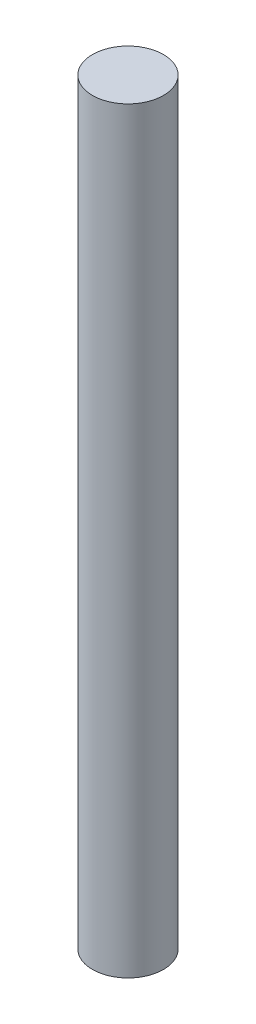
ISO-10303-21;
HEADER;
FILE_DESCRIPTION(('STEP AP214'),'2;1');
FILE_NAME('part.step','',(''),(''),'','','');
FILE_SCHEMA(('AUTOMOTIVE_DESIGN { 1 0 10303 214 1 1 1 1 }'));
ENDSEC;
DATA;
#1=APPLICATION_CONTEXT('core data for automotive mechanical design processes');
#2=APPLICATION_PROTOCOL_DEFINITION('international standard','automotive_design',2000,#1);
#3=PRODUCT_CONTEXT('',#1,'mechanical');
#4=PRODUCT('Part','Part','',(#3));
#5=PRODUCT_RELATED_PRODUCT_CATEGORY('part','',(#4));
#6=PRODUCT_DEFINITION_FORMATION('','',#4);
#7=PRODUCT_DEFINITION_CONTEXT('part definition',#1,'design');
#8=PRODUCT_DEFINITION('design','',#6,#7);
#9=PRODUCT_DEFINITION_SHAPE('','',#8);
#10=(LENGTH_UNIT() NAMED_UNIT(*) SI_UNIT(.MILLI.,.METRE.));
#11=(NAMED_UNIT(*) PLANE_ANGLE_UNIT() SI_UNIT($,.RADIAN.));
#12=(NAMED_UNIT(*) SI_UNIT($,.STERADIAN.) SOLID_ANGLE_UNIT());
#13=UNCERTAINTY_MEASURE_WITH_UNIT(LENGTH_MEASURE(1.E-05),#10,'distance_accuracy_value','');
#14=(GEOMETRIC_REPRESENTATION_CONTEXT(3) GLOBAL_UNCERTAINTY_ASSIGNED_CONTEXT((#13)) GLOBAL_UNIT_ASSIGNED_CONTEXT((#10,
#11,#12)) REPRESENTATION_CONTEXT('',''));
#15=CARTESIAN_POINT('',(0.,0.,0.));
#16=DIRECTION('',(0.,0.,1.));
#17=DIRECTION('',(1.,0.,0.));
#18=AXIS2_PLACEMENT_3D('',#15,#16,#17);
#19=CARTESIAN_POINT('',(0.,32.,0.));
#20=DIRECTION('',(0.,-1.,0.));
#21=DIRECTION('',(0.,0.,-1.));
#22=AXIS2_PLACEMENT_3D('',#19,#20,#21);
#23=CYLINDRICAL_SURFACE('',#22,1.5);
#24=CARTESIAN_POINT('',(0.,32.,0.));
#25=DIRECTION('',(0.,1.,0.));
#26=DIRECTION('',(0.,0.,1.));
#27=AXIS2_PLACEMENT_3D('',#24,#25,#26);
#28=CIRCLE('',#27,1.5);
#29=CARTESIAN_POINT('',(0.,32.,1.5));
#30=VERTEX_POINT('',#29);
#31=EDGE_CURVE('E10',#30,#30,#28,.T.);
#32=ORIENTED_EDGE('',*,*,#31,.F.);
#33=EDGE_LOOP('',(#32));
#34=FACE_BOUND('',#33,.T.);
#35=CARTESIAN_POINT('',(0.,0.,0.));
#36=DIRECTION('',(0.,1.,0.));
#37=DIRECTION('',(0.,0.,1.));
#38=AXIS2_PLACEMENT_3D('',#35,#36,#37);
#39=CIRCLE('',#38,1.5);
#40=CARTESIAN_POINT('',(0.,0.,1.5));
#41=VERTEX_POINT('',#40);
#42=EDGE_CURVE('E34',#41,#41,#39,.T.);
#43=ORIENTED_EDGE('',*,*,#42,.T.);
#44=EDGE_LOOP('',(#43));
#45=FACE_BOUND('',#44,.T.);
#46=ADVANCED_FACE('F31',(#34,#45),#23,.T.);
#47=CARTESIAN_POINT('',(0.,32.,0.));
#48=DIRECTION('',(0.,1.,0.));
#49=DIRECTION('',(0.,0.,1.));
#50=AXIS2_PLACEMENT_3D('',#47,#48,#49);
#51=PLANE('',#50);
#52=ORIENTED_EDGE('',*,*,#31,.T.);
#53=EDGE_LOOP('',(#52));
#54=FACE_BOUND('',#53,.T.);
#55=ADVANCED_FACE('F46',(#54),#51,.T.);
#56=CARTESIAN_POINT('',(0.,0.,0.));
#57=DIRECTION('',(0.,1.,0.));
#58=DIRECTION('',(0.,0.,1.));
#59=AXIS2_PLACEMENT_3D('',#56,#57,#58);
#60=PLANE('',#59);
#61=ORIENTED_EDGE('',*,*,#42,.F.);
#62=EDGE_LOOP('',(#61));
#63=FACE_BOUND('',#62,.T.);
#64=ADVANCED_FACE('F44',(#63),#60,.F.);
#65=CLOSED_SHELL('',(#46,#55,#64));
#66=MANIFOLD_SOLID_BREP('B2',#65);
#67=ADVANCED_BREP_SHAPE_REPRESENTATION('',(#18,#66),#14);
#68=SHAPE_DEFINITION_REPRESENTATION(#9,#67);
ENDSEC;
END-ISO-10303-21;
